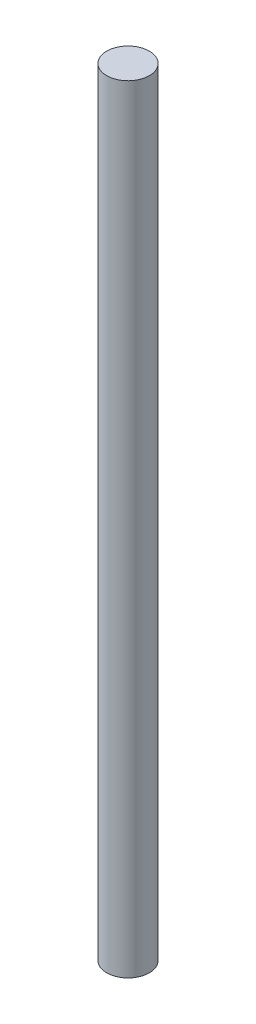
ISO-10303-21;
HEADER;
FILE_DESCRIPTION(('STEP AP214'),'2;1');
FILE_NAME('part.step','',(''),(''),'','','');
FILE_SCHEMA(('AUTOMOTIVE_DESIGN { 1 0 10303 214 1 1 1 1 }'));
ENDSEC;
DATA;
#1=APPLICATION_CONTEXT('core data for automotive mechanical design processes');
#2=APPLICATION_PROTOCOL_DEFINITION('international standard','automotive_design',2000,#1);
#3=PRODUCT_CONTEXT('',#1,'mechanical');
#4=PRODUCT('Part','Part','',(#3));
#5=PRODUCT_RELATED_PRODUCT_CATEGORY('part','',(#4));
#6=PRODUCT_DEFINITION_FORMATION('','',#4);
#7=PRODUCT_DEFINITION_CONTEXT('part definition',#1,'design');
#8=PRODUCT_DEFINITION('design','',#6,#7);
#9=PRODUCT_DEFINITION_SHAPE('','',#8);
#10=(LENGTH_UNIT() NAMED_UNIT(*) SI_UNIT(.MILLI.,.METRE.));
#11=(NAMED_UNIT(*) PLANE_ANGLE_UNIT() SI_UNIT($,.RADIAN.));
#12=(NAMED_UNIT(*) SI_UNIT($,.STERADIAN.) SOLID_ANGLE_UNIT());
#13=UNCERTAINTY_MEASURE_WITH_UNIT(LENGTH_MEASURE(1.E-05),#10,'distance_accuracy_value','');
#14=(GEOMETRIC_REPRESENTATION_CONTEXT(3) GLOBAL_UNCERTAINTY_ASSIGNED_CONTEXT((#13)) GLOBAL_UNIT_ASSIGNED_CONTEXT((#10,
#11,#12)) REPRESENTATION_CONTEXT('',''));
#15=CARTESIAN_POINT('',(0.,0.,0.));
#16=DIRECTION('',(0.,0.,1.));
#17=DIRECTION('',(1.,0.,0.));
#18=AXIS2_PLACEMENT_3D('',#15,#16,#17);
#19=CARTESIAN_POINT('',(0.,173.2,0.));
#20=DIRECTION('',(0.,-1.,0.));
#21=DIRECTION('',(0.,0.,-1.));
#22=AXIS2_PLACEMENT_3D('',#19,#20,#21);
#23=CYLINDRICAL_SURFACE('',#22,2.5);
#24=CARTESIAN_POINT('',(0.,82.,0.));
#25=DIRECTION('',(0.,1.,0.));
#26=DIRECTION('',(0.,0.,1.));
#27=AXIS2_PLACEMENT_3D('',#24,#25,#26);
#28=CIRCLE('',#27,2.5);
#29=CARTESIAN_POINT('',(0.,82.,-2.5));
#30=VERTEX_POINT('',#29);
#31=EDGE_CURVE('E10',#30,#30,#28,.T.);
#32=CARTESIAN_POINT('',(0.,173.2,0.));
#33=DIRECTION('',(0.,1.,0.));
#34=DIRECTION('',(0.,0.,1.));
#35=AXIS2_PLACEMENT_3D('',#32,#33,#34);
#36=CIRCLE('',#35,2.5);
#37=CARTESIAN_POINT('',(0.,173.2,-2.5));
#38=VERTEX_POINT('',#37);
#39=EDGE_CURVE('E42',#38,#38,#36,.T.);
#40=CARTESIAN_POINT('',(0.,82.,-2.5));
#41=CARTESIAN_POINT('',(0.,82.95,-2.5));
#42=CARTESIAN_POINT('',(0.,83.9,-2.5));
#43=CARTESIAN_POINT('',(0.,85.8,-2.5));
#44=CARTESIAN_POINT('',(0.,86.75,-2.5));
#45=CARTESIAN_POINT('',(0.,88.65,-2.5));
#46=CARTESIAN_POINT('',(0.,89.6,-2.5));
#47=CARTESIAN_POINT('',(0.,91.5,-2.5));
#48=CARTESIAN_POINT('',(0.,92.45,-2.5));
#49=CARTESIAN_POINT('',(0.,94.35,-2.5));
#50=CARTESIAN_POINT('',(0.,95.3,-2.5));
#51=CARTESIAN_POINT('',(0.,97.2,-2.5));
#52=CARTESIAN_POINT('',(0.,98.15,-2.5));
#53=CARTESIAN_POINT('',(0.,100.05,-2.5));
#54=CARTESIAN_POINT('',(0.,101.,-2.5));
#55=CARTESIAN_POINT('',(0.,102.9,-2.5));
#56=CARTESIAN_POINT('',(0.,103.85,-2.5));
#57=CARTESIAN_POINT('',(0.,105.75,-2.5));
#58=CARTESIAN_POINT('',(0.,106.7,-2.5));
#59=CARTESIAN_POINT('',(0.,108.6,-2.5));
#60=CARTESIAN_POINT('',(0.,109.55,-2.5));
#61=CARTESIAN_POINT('',(0.,111.45,-2.5));
#62=CARTESIAN_POINT('',(0.,112.4,-2.5));
#63=CARTESIAN_POINT('',(0.,114.3,-2.5));
#64=CARTESIAN_POINT('',(0.,115.25,-2.5));
#65=CARTESIAN_POINT('',(0.,117.15,-2.5));
#66=CARTESIAN_POINT('',(0.,118.1,-2.5));
#67=CARTESIAN_POINT('',(0.,120.,-2.5));
#68=CARTESIAN_POINT('',(0.,120.95,-2.5));
#69=CARTESIAN_POINT('',(0.,122.85,-2.5));
#70=CARTESIAN_POINT('',(0.,123.8,-2.5));
#71=CARTESIAN_POINT('',(0.,125.7,-2.5));
#72=CARTESIAN_POINT('',(0.,126.65,-2.5));
#73=CARTESIAN_POINT('',(0.,128.55,-2.5));
#74=CARTESIAN_POINT('',(0.,129.5,-2.5));
#75=CARTESIAN_POINT('',(0.,131.4,-2.5));
#76=CARTESIAN_POINT('',(0.,132.35,-2.5));
#77=CARTESIAN_POINT('',(0.,134.25,-2.5));
#78=CARTESIAN_POINT('',(0.,135.2,-2.5));
#79=CARTESIAN_POINT('',(0.,137.1,-2.5));
#80=CARTESIAN_POINT('',(0.,138.05,-2.5));
#81=CARTESIAN_POINT('',(0.,139.95,-2.5));
#82=CARTESIAN_POINT('',(0.,140.9,-2.5));
#83=CARTESIAN_POINT('',(0.,142.8,-2.5));
#84=CARTESIAN_POINT('',(0.,143.75,-2.5));
#85=CARTESIAN_POINT('',(0.,145.65,-2.5));
#86=CARTESIAN_POINT('',(0.,146.6,-2.5));
#87=CARTESIAN_POINT('',(0.,148.5,-2.5));
#88=CARTESIAN_POINT('',(0.,149.45,-2.5));
#89=CARTESIAN_POINT('',(0.,151.35,-2.5));
#90=CARTESIAN_POINT('',(0.,152.3,-2.5));
#91=CARTESIAN_POINT('',(0.,154.2,-2.5));
#92=CARTESIAN_POINT('',(0.,155.15,-2.5));
#93=CARTESIAN_POINT('',(0.,157.05,-2.5));
#94=CARTESIAN_POINT('',(0.,158.,-2.5));
#95=CARTESIAN_POINT('',(0.,159.9,-2.5));
#96=CARTESIAN_POINT('',(0.,160.85,-2.5));
#97=CARTESIAN_POINT('',(0.,162.75,-2.5));
#98=CARTESIAN_POINT('',(0.,163.7,-2.5));
#99=CARTESIAN_POINT('',(0.,165.6,-2.5));
#100=CARTESIAN_POINT('',(0.,166.55,-2.5));
#101=CARTESIAN_POINT('',(0.,168.45,-2.5));
#102=CARTESIAN_POINT('',(0.,169.4,-2.5));
#103=CARTESIAN_POINT('',(0.,171.3,-2.5));
#104=CARTESIAN_POINT('',(0.,172.25,-2.5));
#105=CARTESIAN_POINT('',(0.,173.2,-2.5));
#106=B_SPLINE_CURVE_WITH_KNOTS('',3,(#40,#41,#42,#43,#44,#45,#46,#47,#48,#49,#50,#51,#52,#53,
#54,#55,#56,#57,#58,#59,#60,#61,#62,#63,#64,#65,#66,#67,#68,#69,#70,#71,#72,#73,#74,#75,#76,#77,
#78,#79,#80,#81,#82,#83,#84,#85,#86,#87,#88,#89,#90,#91,#92,#93,#94,#95,#96,#97,#98,#99,#100,
#101,#102,#103,#104,#105),.UNSPECIFIED.,.F.,.F.,(4,2,2,2,2,2,2,2,2,2,2,2,2,2,2,2,2,2,2,2,2,2,2,
2,2,2,2,2,2,2,2,2,4),(0.,2.85000000000001,5.7,8.55,11.4,14.25,17.1,19.95,22.8,25.65,28.5,31.35,
34.2,37.05,39.9,42.75,45.6,48.45,51.3,54.15,57.,59.85,62.7,65.55,68.4,71.25,74.1,76.95,79.8,
82.65,85.5,88.35,91.2),.UNSPECIFIED.);
#107=EDGE_CURVE('BSEAM36',#30,#38,#106,.T.);
#108=ORIENTED_EDGE('',*,*,#31,.T.);
#109=ORIENTED_EDGE('',*,*,#39,.F.);
#110=ORIENTED_EDGE('',*,*,#107,.T.);
#111=ORIENTED_EDGE('',*,*,#107,.F.);
#112=EDGE_LOOP('',(#108,#110,#109,#111));
#113=FACE_BOUND('',#112,.T.);
#114=ADVANCED_FACE('F36',(#113),#23,.T.);
#115=CARTESIAN_POINT('',(0.,82.,0.));
#116=DIRECTION('',(0.,1.,0.));
#117=DIRECTION('',(0.,0.,1.));
#118=AXIS2_PLACEMENT_3D('',#115,#116,#117);
#119=PLANE('',#118);
#120=ORIENTED_EDGE('',*,*,#31,.F.);
#121=EDGE_LOOP('',(#120));
#122=FACE_BOUND('',#121,.T.);
#123=ADVANCED_FACE('F51',(#122),#119,.F.);
#124=CARTESIAN_POINT('',(0.,173.2,0.));
#125=DIRECTION('',(0.,1.,0.));
#126=DIRECTION('',(0.,0.,1.));
#127=AXIS2_PLACEMENT_3D('',#124,#125,#126);
#128=PLANE('',#127);
#129=ORIENTED_EDGE('',*,*,#39,.T.);
#130=EDGE_LOOP('',(#129));
#131=FACE_BOUND('',#130,.T.);
#132=ADVANCED_FACE('F48',(#131),#128,.T.);
#133=CLOSED_SHELL('',(#114,#123,#132));
#134=MANIFOLD_SOLID_BREP('B2',#133);
#135=ADVANCED_BREP_SHAPE_REPRESENTATION('',(#18,#134),#14);
#136=SHAPE_DEFINITION_REPRESENTATION(#9,#135);
ENDSEC;
END-ISO-10303-21;
